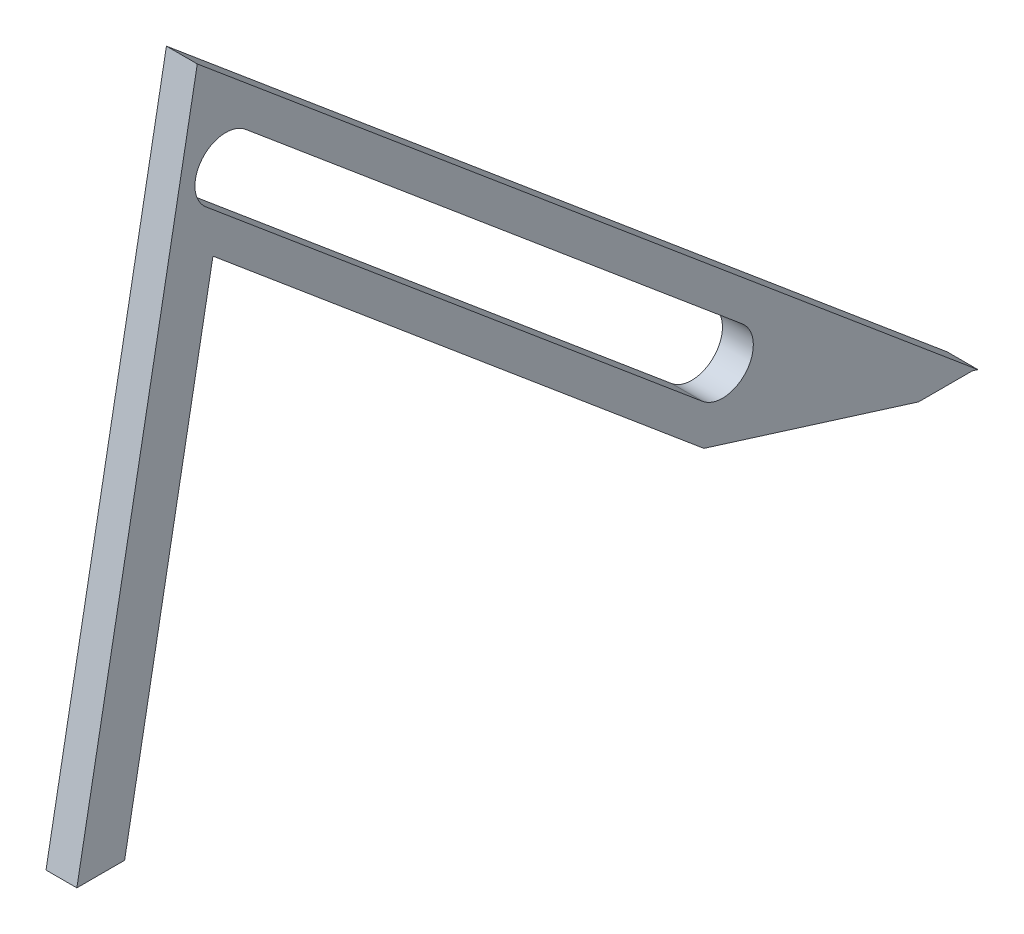
ISO-10303-21;
HEADER;
FILE_DESCRIPTION(('STEP AP214'),'2;1');
FILE_NAME('part.step','',(''),(''),'','','');
FILE_SCHEMA(('AUTOMOTIVE_DESIGN { 1 0 10303 214 1 1 1 1 }'));
ENDSEC;
DATA;
#1=APPLICATION_CONTEXT('core data for automotive mechanical design processes');
#2=APPLICATION_PROTOCOL_DEFINITION('international standard','automotive_design',2000,#1);
#3=PRODUCT_CONTEXT('',#1,'mechanical');
#4=PRODUCT('Part','Part','',(#3));
#5=PRODUCT_RELATED_PRODUCT_CATEGORY('part','',(#4));
#6=PRODUCT_DEFINITION_FORMATION('','',#4);
#7=PRODUCT_DEFINITION_CONTEXT('part definition',#1,'design');
#8=PRODUCT_DEFINITION('design','',#6,#7);
#9=PRODUCT_DEFINITION_SHAPE('','',#8);
#10=(LENGTH_UNIT() NAMED_UNIT(*) SI_UNIT(.MILLI.,.METRE.));
#11=(NAMED_UNIT(*) PLANE_ANGLE_UNIT() SI_UNIT($,.RADIAN.));
#12=(NAMED_UNIT(*) SI_UNIT($,.STERADIAN.) SOLID_ANGLE_UNIT());
#13=UNCERTAINTY_MEASURE_WITH_UNIT(LENGTH_MEASURE(1.E-05),#10,'distance_accuracy_value','');
#14=(GEOMETRIC_REPRESENTATION_CONTEXT(3) GLOBAL_UNCERTAINTY_ASSIGNED_CONTEXT((#13)) GLOBAL_UNIT_ASSIGNED_CONTEXT((#10,
#11,#12)) REPRESENTATION_CONTEXT('',''));
#15=CARTESIAN_POINT('',(0.,0.,0.));
#16=DIRECTION('',(0.,0.,1.));
#17=DIRECTION('',(1.,0.,0.));
#18=AXIS2_PLACEMENT_3D('',#15,#16,#17);
#19=CARTESIAN_POINT('',(12.7,0.,0.));
#20=DIRECTION('',(-1.,0.,0.));
#21=DIRECTION('',(0.,0.,1.));
#22=AXIS2_PLACEMENT_3D('',#19,#20,#21);
#23=PLANE('',#22);
#24=DIRECTION('',(0.,0.642787609686541,0.766044443118977));
#25=VECTOR('',#24,1.);
#26=CARTESIAN_POINT('',(12.7,268.859,394.946506416283));
#27=LINE('',#26,#25);
#28=CARTESIAN_POINT('',(12.7,-0.719711787625588,73.6751081564618));
#29=VERTEX_POINT('',#28);
#30=CARTESIAN_POINT('',(12.7,268.859,394.946506416283));
#31=VERTEX_POINT('',#30);
#32=EDGE_CURVE('E177',#29,#31,#27,.T.);
#33=ORIENTED_EDGE('',*,*,#32,.T.);
#34=DIRECTION('',(0.,-0.983435695369446,0.181257366948804));
#35=VECTOR('',#34,1.);
#36=CARTESIAN_POINT('',(12.7,268.859,394.946506416283));
#37=LINE('',#36,#35);
#38=CARTESIAN_POINT('',(12.7,0.,444.5));
#39=VERTEX_POINT('',#38);
#40=EDGE_CURVE('E181',#31,#39,#37,.T.);
#41=ORIENTED_EDGE('',*,*,#40,.T.);
#42=DIRECTION('',(0.,0.,-1.));
#43=VECTOR('',#42,1.);
#44=CARTESIAN_POINT('',(12.7,0.,444.5));
#45=LINE('',#44,#43);
#46=CARTESIAN_POINT('',(12.7,0.,424.843977236597));
#47=VERTEX_POINT('',#46);
#48=EDGE_CURVE('E185',#39,#47,#45,.T.);
#49=ORIENTED_EDGE('',*,*,#48,.T.);
#50=DIRECTION('',(0.,0.983435695369447,-0.181257366948804));
#51=VECTOR('',#50,1.);
#52=CARTESIAN_POINT('',(12.7,197.142278950978,388.508616861543));
#53=LINE('',#52,#51);
#54=CARTESIAN_POINT('',(12.7,197.142278950978,388.508616861543));
#55=VERTEX_POINT('',#54);
#56=EDGE_CURVE('E188',#47,#55,#53,.T.);
#57=ORIENTED_EDGE('',*,*,#56,.T.);
#58=DIRECTION('',(0.,-0.642787609686541,-0.766044443118977));
#59=VECTOR('',#58,1.);
#60=CARTESIAN_POINT('',(12.7,95.1545863957431,266.964417858448));
#61=LINE('',#60,#59);
#62=CARTESIAN_POINT('',(12.7,27.6046616655407,186.461552381761));
#63=VERTEX_POINT('',#62);
#64=EDGE_CURVE('E191',#55,#63,#61,.T.);
#65=ORIENTED_EDGE('',*,*,#64,.T.);
#66=DIRECTION('',(0.,-0.298169770817871,-0.954512853643375));
#67=VECTOR('',#66,1.);
#68=CARTESIAN_POINT('',(12.7,0.,98.092418555886));
#69=LINE('',#68,#67);
#70=CARTESIAN_POINT('',(12.7,0.,98.092418555886));
#71=VERTEX_POINT('',#70);
#72=EDGE_CURVE('E194',#63,#71,#69,.T.);
#73=ORIENTED_EDGE('',*,*,#72,.T.);
#74=DIRECTION('',(0.,0.,-1.));
#75=VECTOR('',#74,1.);
#76=CARTESIAN_POINT('',(12.7,0.,98.092418555886));
#77=LINE('',#76,#75);
#78=CARTESIAN_POINT('',(12.7,0.,75.9790779731299));
#79=VERTEX_POINT('',#78);
#80=EDGE_CURVE('E197',#71,#79,#77,.T.);
#81=ORIENTED_EDGE('',*,*,#80,.T.);
#82=DIRECTION('',(0.,-0.298169770817916,-0.95451285364336));
#83=VECTOR('',#82,1.);
#84=CARTESIAN_POINT('',(12.7,-0.719711787625588,73.6751081564618));
#85=LINE('',#84,#83);
#86=EDGE_CURVE('E200',#79,#29,#85,.T.);
#87=ORIENTED_EDGE('',*,*,#86,.T.);
#88=EDGE_LOOP('',(#33,#41,#49,#57,#65,#73,#81,#87));
#89=FACE_BOUND('',#88,.T.);
#90=CARTESIAN_POINT('',(12.7,225.858521182833,383.215916504907));
#91=DIRECTION('',(1.,0.,0.));
#92=DIRECTION('',(0.,0.,-1.));
#93=AXIS2_PLACEMENT_3D('',#90,#91,#92);
#94=CIRCLE('',#93,12.7000000000001);
#95=CARTESIAN_POINT('',(12.7,235.587285610444,375.052513861888));
#96=VERTEX_POINT('',#95);
#97=CARTESIAN_POINT('',(12.7,216.129756755222,391.379319147927));
#98=VERTEX_POINT('',#97);
#99=EDGE_CURVE('E129',#96,#98,#94,.T.);
#100=ORIENTED_EDGE('',*,*,#99,.F.);
#101=DIRECTION('',(0.,0.642787609686541,0.766044443118977));
#102=VECTOR('',#101,1.);
#103=CARTESIAN_POINT('',(12.7,235.587285610444,375.052513861888));
#104=LINE('',#103,#102);
#105=CARTESIAN_POINT('',(12.7,64.0875735637953,170.667115901423));
#106=VERTEX_POINT('',#105);
#107=EDGE_CURVE('E155',#106,#96,#104,.T.);
#108=ORIENTED_EDGE('',*,*,#107,.F.);
#109=CARTESIAN_POINT('',(12.7,54.3588091361843,178.830518544442));
#110=DIRECTION('',(1.,0.,0.));
#111=DIRECTION('',(0.,0.,-1.));
#112=AXIS2_PLACEMENT_3D('',#109,#110,#111);
#113=CIRCLE('',#112,12.7);
#114=CARTESIAN_POINT('',(12.7,44.6300447085733,186.993921187461));
#115=VERTEX_POINT('',#114);
#116=EDGE_CURVE('E151',#115,#106,#113,.T.);
#117=ORIENTED_EDGE('',*,*,#116,.F.);
#118=DIRECTION('',(0.,-0.64278760968654,-0.766044443118977));
#119=VECTOR('',#118,1.);
#120=CARTESIAN_POINT('',(12.7,216.129756755222,391.379319147927));
#121=LINE('',#120,#119);
#122=EDGE_CURVE('E138',#98,#115,#121,.T.);
#123=ORIENTED_EDGE('',*,*,#122,.F.);
#124=EDGE_LOOP('',(#100,#108,#117,#123));
#125=FACE_BOUND('',#124,.T.);
#126=ADVANCED_FACE('F39',(#89,#125),#23,.F.);
#127=CARTESIAN_POINT('',(0.,0.,0.));
#128=DIRECTION('',(-1.,0.,0.));
#129=DIRECTION('',(0.,0.,1.));
#130=AXIS2_PLACEMENT_3D('',#127,#128,#129);
#131=PLANE('',#130);
#132=DIRECTION('',(0.,0.642787609686541,0.766044443118977));
#133=VECTOR('',#132,1.);
#134=CARTESIAN_POINT('',(0.,268.859,394.946506416283));
#135=LINE('',#134,#133);
#136=CARTESIAN_POINT('',(0.,-0.719711787625588,73.6751081564618));
#137=VERTEX_POINT('',#136);
#138=CARTESIAN_POINT('',(0.,268.859,394.946506416283));
#139=VERTEX_POINT('',#138);
#140=EDGE_CURVE('E147',#137,#139,#135,.T.);
#141=ORIENTED_EDGE('',*,*,#140,.F.);
#142=DIRECTION('',(0.,-0.298169770817916,-0.95451285364336));
#143=VECTOR('',#142,1.);
#144=CARTESIAN_POINT('',(0.,-0.719711787625588,73.6751081564618));
#145=LINE('',#144,#143);
#146=CARTESIAN_POINT('',(0.,0.,75.9790779731299));
#147=VERTEX_POINT('',#146);
#148=EDGE_CURVE('E182',#147,#137,#145,.T.);
#149=ORIENTED_EDGE('',*,*,#148,.F.);
#150=DIRECTION('',(0.,0.,-1.));
#151=VECTOR('',#150,1.);
#152=CARTESIAN_POINT('',(0.,0.,98.092418555886));
#153=LINE('',#152,#151);
#154=CARTESIAN_POINT('',(0.,0.,98.092418555886));
#155=VERTEX_POINT('',#154);
#156=EDGE_CURVE('E223',#155,#147,#153,.T.);
#157=ORIENTED_EDGE('',*,*,#156,.F.);
#158=DIRECTION('',(0.,-0.298169770817871,-0.954512853643375));
#159=VECTOR('',#158,1.);
#160=CARTESIAN_POINT('',(0.,0.,98.092418555886));
#161=LINE('',#160,#159);
#162=CARTESIAN_POINT('',(0.,27.6046616655407,186.461552381761));
#163=VERTEX_POINT('',#162);
#164=EDGE_CURVE('E220',#163,#155,#161,.T.);
#165=ORIENTED_EDGE('',*,*,#164,.F.);
#166=DIRECTION('',(0.,-0.64278760968654,-0.766044443118977));
#167=VECTOR('',#166,1.);
#168=CARTESIAN_POINT('',(0.,95.1545863957431,266.964417858448));
#169=LINE('',#168,#167);
#170=CARTESIAN_POINT('',(0.,197.142278950978,388.508616861543));
#171=VERTEX_POINT('',#170);
#172=EDGE_CURVE('E217',#171,#163,#169,.T.);
#173=ORIENTED_EDGE('',*,*,#172,.F.);
#174=DIRECTION('',(0.,0.983435695369447,-0.181257366948804));
#175=VECTOR('',#174,1.);
#176=CARTESIAN_POINT('',(0.,197.142278950978,388.508616861543));
#177=LINE('',#176,#175);
#178=CARTESIAN_POINT('',(0.,0.,424.843977236597));
#179=VERTEX_POINT('',#178);
#180=EDGE_CURVE('E213',#179,#171,#177,.T.);
#181=ORIENTED_EDGE('',*,*,#180,.F.);
#182=DIRECTION('',(0.,0.,-1.));
#183=VECTOR('',#182,1.);
#184=CARTESIAN_POINT('',(0.,0.,444.5));
#185=LINE('',#184,#183);
#186=CARTESIAN_POINT('',(0.,0.,444.5));
#187=VERTEX_POINT('',#186);
#188=EDGE_CURVE('E210',#187,#179,#185,.T.);
#189=ORIENTED_EDGE('',*,*,#188,.F.);
#190=DIRECTION('',(0.,-0.983435695369446,0.181257366948804));
#191=VECTOR('',#190,1.);
#192=CARTESIAN_POINT('',(0.,268.859,394.946506416283));
#193=LINE('',#192,#191);
#194=EDGE_CURVE('E207',#139,#187,#193,.T.);
#195=ORIENTED_EDGE('',*,*,#194,.F.);
#196=EDGE_LOOP('',(#141,#149,#157,#165,#173,#181,#189,#195));
#197=FACE_BOUND('',#196,.T.);
#198=DIRECTION('',(0.,0.642787609686541,0.766044443118977));
#199=VECTOR('',#198,1.);
#200=CARTESIAN_POINT('',(0.,235.587285610444,375.052513861888));
#201=LINE('',#200,#199);
#202=CARTESIAN_POINT('',(0.,64.0875735637952,170.667115901423));
#203=VERTEX_POINT('',#202);
#204=CARTESIAN_POINT('',(0.,235.587285610444,375.052513861888));
#205=VERTEX_POINT('',#204);
#206=EDGE_CURVE('E139',#203,#205,#201,.T.);
#207=ORIENTED_EDGE('',*,*,#206,.T.);
#208=CARTESIAN_POINT('',(0.,225.858521182833,383.215916504907));
#209=DIRECTION('',(1.,0.,0.));
#210=DIRECTION('',(0.,0.,-1.));
#211=AXIS2_PLACEMENT_3D('',#208,#209,#210);
#212=CIRCLE('',#211,12.7000000000001);
#213=CARTESIAN_POINT('',(0.,216.129756755222,391.379319147927));
#214=VERTEX_POINT('',#213);
#215=EDGE_CURVE('E63',#205,#214,#212,.T.);
#216=ORIENTED_EDGE('',*,*,#215,.T.);
#217=DIRECTION('',(0.,-0.64278760968654,-0.766044443118977));
#218=VECTOR('',#217,1.);
#219=CARTESIAN_POINT('',(0.,216.129756755222,391.379319147927));
#220=LINE('',#219,#218);
#221=CARTESIAN_POINT('',(0.,44.6300447085733,186.993921187461));
#222=VERTEX_POINT('',#221);
#223=EDGE_CURVE('E145',#214,#222,#220,.T.);
#224=ORIENTED_EDGE('',*,*,#223,.T.);
#225=CARTESIAN_POINT('',(0.,54.3588091361843,178.830518544442));
#226=DIRECTION('',(1.,0.,0.));
#227=DIRECTION('',(0.,0.,-1.));
#228=AXIS2_PLACEMENT_3D('',#225,#226,#227);
#229=CIRCLE('',#228,12.7);
#230=EDGE_CURVE('E164',#222,#203,#229,.T.);
#231=ORIENTED_EDGE('',*,*,#230,.T.);
#232=EDGE_LOOP('',(#207,#216,#224,#231));
#233=FACE_BOUND('',#232,.T.);
#234=ADVANCED_FACE('F262',(#197,#233),#131,.T.);
#235=CARTESIAN_POINT('',(12.7,268.859,394.946506416283));
#236=DIRECTION('',(0.,-0.766044443118977,0.64278760968654));
#237=DIRECTION('',(0.,-0.642787609686541,-0.766044443118977));
#238=AXIS2_PLACEMENT_3D('',#235,#236,#237);
#239=PLANE('',#238);
#240=ORIENTED_EDGE('',*,*,#140,.T.);
#241=DIRECTION('',(-1.,0.,0.));
#242=VECTOR('',#241,1.);
#243=CARTESIAN_POINT('',(12.7,268.859,394.946506416283));
#244=LINE('',#243,#242);
#245=EDGE_CURVE('E11',#31,#139,#244,.T.);
#246=ORIENTED_EDGE('',*,*,#245,.F.);
#247=ORIENTED_EDGE('',*,*,#32,.F.);
#248=DIRECTION('',(-1.,0.,0.));
#249=VECTOR('',#248,1.);
#250=CARTESIAN_POINT('',(12.7,-0.719711787625588,73.6751081564618));
#251=LINE('',#250,#249);
#252=EDGE_CURVE('E203',#29,#137,#251,.T.);
#253=ORIENTED_EDGE('',*,*,#252,.T.);
#254=EDGE_LOOP('',(#240,#246,#247,#253));
#255=FACE_BOUND('',#254,.T.);
#256=ADVANCED_FACE('F41',(#255),#239,.F.);
#257=CARTESIAN_POINT('',(12.7,268.859,394.946506416283));
#258=DIRECTION('',(0.,-0.181257366948804,-0.983435695369446));
#259=DIRECTION('',(0.,0.983435695369447,-0.181257366948804));
#260=AXIS2_PLACEMENT_3D('',#257,#258,#259);
#261=PLANE('',#260);
#262=ORIENTED_EDGE('',*,*,#194,.T.);
#263=DIRECTION('',(-1.,0.,0.));
#264=VECTOR('',#263,1.);
#265=CARTESIAN_POINT('',(12.7,0.,444.5));
#266=LINE('',#265,#264);
#267=EDGE_CURVE('E48',#39,#187,#266,.T.);
#268=ORIENTED_EDGE('',*,*,#267,.F.);
#269=ORIENTED_EDGE('',*,*,#40,.F.);
#270=ORIENTED_EDGE('',*,*,#245,.T.);
#271=EDGE_LOOP('',(#262,#268,#269,#270));
#272=FACE_BOUND('',#271,.T.);
#273=ADVANCED_FACE('F278',(#272),#261,.F.);
#274=CARTESIAN_POINT('',(12.7,0.,444.5));
#275=DIRECTION('',(0.,1.,0.));
#276=DIRECTION('',(0.,0.,1.));
#277=AXIS2_PLACEMENT_3D('',#274,#275,#276);
#278=PLANE('',#277);
#279=ORIENTED_EDGE('',*,*,#188,.T.);
#280=DIRECTION('',(-1.,0.,0.));
#281=VECTOR('',#280,1.);
#282=CARTESIAN_POINT('',(12.7,0.,424.843977236597));
#283=LINE('',#282,#281);
#284=EDGE_CURVE('E247',#47,#179,#283,.T.);
#285=ORIENTED_EDGE('',*,*,#284,.F.);
#286=ORIENTED_EDGE('',*,*,#48,.F.);
#287=ORIENTED_EDGE('',*,*,#267,.T.);
#288=EDGE_LOOP('',(#279,#285,#286,#287));
#289=FACE_BOUND('',#288,.T.);
#290=ADVANCED_FACE('F256',(#289),#278,.F.);
#291=CARTESIAN_POINT('',(12.7,197.142278950978,388.508616861543));
#292=DIRECTION('',(0.,0.181257366948804,0.983435695369446));
#293=DIRECTION('',(0.,-0.983435695369446,0.181257366948804));
#294=AXIS2_PLACEMENT_3D('',#291,#292,#293);
#295=PLANE('',#294);
#296=ORIENTED_EDGE('',*,*,#180,.T.);
#297=DIRECTION('',(-1.,0.,0.));
#298=VECTOR('',#297,1.);
#299=CARTESIAN_POINT('',(12.7,197.142278950978,388.508616861543));
#300=LINE('',#299,#298);
#301=EDGE_CURVE('E243',#55,#171,#300,.T.);
#302=ORIENTED_EDGE('',*,*,#301,.F.);
#303=ORIENTED_EDGE('',*,*,#56,.F.);
#304=ORIENTED_EDGE('',*,*,#284,.T.);
#305=EDGE_LOOP('',(#296,#302,#303,#304));
#306=FACE_BOUND('',#305,.T.);
#307=ADVANCED_FACE('F267',(#306),#295,.F.);
#308=CARTESIAN_POINT('',(12.7,95.1545863957431,266.964417858448));
#309=DIRECTION('',(0.,0.766044443118977,-0.64278760968654));
#310=DIRECTION('',(0.,0.64278760968654,0.766044443118977));
#311=AXIS2_PLACEMENT_3D('',#308,#309,#310);
#312=PLANE('',#311);
#313=ORIENTED_EDGE('',*,*,#172,.T.);
#314=DIRECTION('',(-1.,0.,0.));
#315=VECTOR('',#314,1.);
#316=CARTESIAN_POINT('',(12.7,27.6046616655407,186.461552381761));
#317=LINE('',#316,#315);
#318=EDGE_CURVE('E239',#63,#163,#317,.T.);
#319=ORIENTED_EDGE('',*,*,#318,.F.);
#320=ORIENTED_EDGE('',*,*,#64,.F.);
#321=ORIENTED_EDGE('',*,*,#301,.T.);
#322=EDGE_LOOP('',(#313,#319,#320,#321));
#323=FACE_BOUND('',#322,.T.);
#324=ADVANCED_FACE('F271',(#323),#312,.F.);
#325=CARTESIAN_POINT('',(12.7,0.,98.092418555886));
#326=DIRECTION('',(0.,0.954512853643374,-0.298169770817871));
#327=DIRECTION('',(0.,0.298169770817871,0.954512853643375));
#328=AXIS2_PLACEMENT_3D('',#325,#326,#327);
#329=PLANE('',#328);
#330=ORIENTED_EDGE('',*,*,#164,.T.);
#331=DIRECTION('',(-1.,0.,0.));
#332=VECTOR('',#331,1.);
#333=CARTESIAN_POINT('',(12.7,0.,98.092418555886));
#334=LINE('',#333,#332);
#335=EDGE_CURVE('E235',#71,#155,#334,.T.);
#336=ORIENTED_EDGE('',*,*,#335,.F.);
#337=ORIENTED_EDGE('',*,*,#72,.F.);
#338=ORIENTED_EDGE('',*,*,#318,.T.);
#339=EDGE_LOOP('',(#330,#336,#337,#338));
#340=FACE_BOUND('',#339,.T.);
#341=ADVANCED_FACE('F291',(#340),#329,.F.);
#342=CARTESIAN_POINT('',(12.7,0.,98.092418555886));
#343=DIRECTION('',(0.,1.,0.));
#344=DIRECTION('',(0.,0.,1.));
#345=AXIS2_PLACEMENT_3D('',#342,#343,#344);
#346=PLANE('',#345);
#347=ORIENTED_EDGE('',*,*,#156,.T.);
#348=DIRECTION('',(-1.,0.,0.));
#349=VECTOR('',#348,1.);
#350=CARTESIAN_POINT('',(12.7,0.,75.9790779731299));
#351=LINE('',#350,#349);
#352=EDGE_CURVE('E231',#79,#147,#351,.T.);
#353=ORIENTED_EDGE('',*,*,#352,.F.);
#354=ORIENTED_EDGE('',*,*,#80,.F.);
#355=ORIENTED_EDGE('',*,*,#335,.T.);
#356=EDGE_LOOP('',(#347,#353,#354,#355));
#357=FACE_BOUND('',#356,.T.);
#358=ADVANCED_FACE('F289',(#357),#346,.F.);
#359=CARTESIAN_POINT('',(12.7,-0.719711787625588,73.6751081564618));
#360=DIRECTION('',(0.,0.95451285364336,-0.298169770817916));
#361=DIRECTION('',(0.,0.298169770817916,0.954512853643361));
#362=AXIS2_PLACEMENT_3D('',#359,#360,#361);
#363=PLANE('',#362);
#364=ORIENTED_EDGE('',*,*,#148,.T.);
#365=ORIENTED_EDGE('',*,*,#252,.F.);
#366=ORIENTED_EDGE('',*,*,#86,.F.);
#367=ORIENTED_EDGE('',*,*,#352,.T.);
#368=EDGE_LOOP('',(#364,#365,#366,#367));
#369=FACE_BOUND('',#368,.T.);
#370=ADVANCED_FACE('F284',(#369),#363,.F.);
#371=CARTESIAN_POINT('',(12.7,225.858521182833,383.215916504907));
#372=DIRECTION('',(-1.,0.,0.));
#373=DIRECTION('',(0.,0.,1.));
#374=AXIS2_PLACEMENT_3D('',#371,#372,#373);
#375=CYLINDRICAL_SURFACE('',#374,12.7000000000001);
#376=ORIENTED_EDGE('',*,*,#215,.F.);
#377=DIRECTION('',(-1.,0.,0.));
#378=VECTOR('',#377,1.);
#379=CARTESIAN_POINT('',(12.7,235.587285610444,375.052513861888));
#380=LINE('',#379,#378);
#381=EDGE_CURVE('E133',#96,#205,#380,.T.);
#382=ORIENTED_EDGE('',*,*,#381,.F.);
#383=ORIENTED_EDGE('',*,*,#99,.T.);
#384=DIRECTION('',(-1.,0.,0.));
#385=VECTOR('',#384,1.);
#386=CARTESIAN_POINT('',(12.7,216.129756755222,391.379319147927));
#387=LINE('',#386,#385);
#388=EDGE_CURVE('E132',#98,#214,#387,.T.);
#389=ORIENTED_EDGE('',*,*,#388,.T.);
#390=EDGE_LOOP('',(#376,#382,#383,#389));
#391=FACE_BOUND('',#390,.T.);
#392=ADVANCED_FACE('F131',(#391),#375,.F.);
#393=CARTESIAN_POINT('',(12.7,216.129756755222,391.379319147927));
#394=DIRECTION('',(0.,0.766044443118977,-0.64278760968654));
#395=DIRECTION('',(0.,0.64278760968654,0.766044443118977));
#396=AXIS2_PLACEMENT_3D('',#393,#394,#395);
#397=PLANE('',#396);
#398=ORIENTED_EDGE('',*,*,#223,.F.);
#399=ORIENTED_EDGE('',*,*,#388,.F.);
#400=ORIENTED_EDGE('',*,*,#122,.T.);
#401=DIRECTION('',(-1.,0.,0.));
#402=VECTOR('',#401,1.);
#403=CARTESIAN_POINT('',(12.7,44.6300447085733,186.993921187461));
#404=LINE('',#403,#402);
#405=EDGE_CURVE('E148',#115,#222,#404,.T.);
#406=ORIENTED_EDGE('',*,*,#405,.T.);
#407=EDGE_LOOP('',(#398,#399,#400,#406));
#408=FACE_BOUND('',#407,.T.);
#409=ADVANCED_FACE('F142',(#408),#397,.T.);
#410=CARTESIAN_POINT('',(12.7,54.3588091361843,178.830518544442));
#411=DIRECTION('',(-1.,0.,0.));
#412=DIRECTION('',(0.,0.,1.));
#413=AXIS2_PLACEMENT_3D('',#410,#411,#412);
#414=CYLINDRICAL_SURFACE('',#413,12.7);
#415=ORIENTED_EDGE('',*,*,#230,.F.);
#416=ORIENTED_EDGE('',*,*,#405,.F.);
#417=ORIENTED_EDGE('',*,*,#116,.T.);
#418=DIRECTION('',(-1.,0.,0.));
#419=VECTOR('',#418,1.);
#420=CARTESIAN_POINT('',(12.7,64.0875735637952,170.667115901423));
#421=LINE('',#420,#419);
#422=EDGE_CURVE('E55',#106,#203,#421,.T.);
#423=ORIENTED_EDGE('',*,*,#422,.T.);
#424=EDGE_LOOP('',(#415,#416,#417,#423));
#425=FACE_BOUND('',#424,.T.);
#426=ADVANCED_FACE('F316',(#425),#414,.F.);
#427=CARTESIAN_POINT('',(12.7,235.587285610444,375.052513861888));
#428=DIRECTION('',(0.,-0.766044443118977,0.64278760968654));
#429=DIRECTION('',(0.,-0.642787609686541,-0.766044443118977));
#430=AXIS2_PLACEMENT_3D('',#427,#428,#429);
#431=PLANE('',#430);
#432=ORIENTED_EDGE('',*,*,#206,.F.);
#433=ORIENTED_EDGE('',*,*,#422,.F.);
#434=ORIENTED_EDGE('',*,*,#107,.T.);
#435=ORIENTED_EDGE('',*,*,#381,.T.);
#436=EDGE_LOOP('',(#432,#433,#434,#435));
#437=FACE_BOUND('',#436,.T.);
#438=ADVANCED_FACE('F320',(#437),#431,.T.);
#439=CLOSED_SHELL('',(#126,#234,#256,#273,#290,#307,#324,#341,#358,#370,#392,#409,#426,#438));
#440=MANIFOLD_SOLID_BREP('B2',#439);
#441=ADVANCED_BREP_SHAPE_REPRESENTATION('',(#18,#440),#14);
#442=SHAPE_DEFINITION_REPRESENTATION(#9,#441);
ENDSEC;
END-ISO-10303-21;
